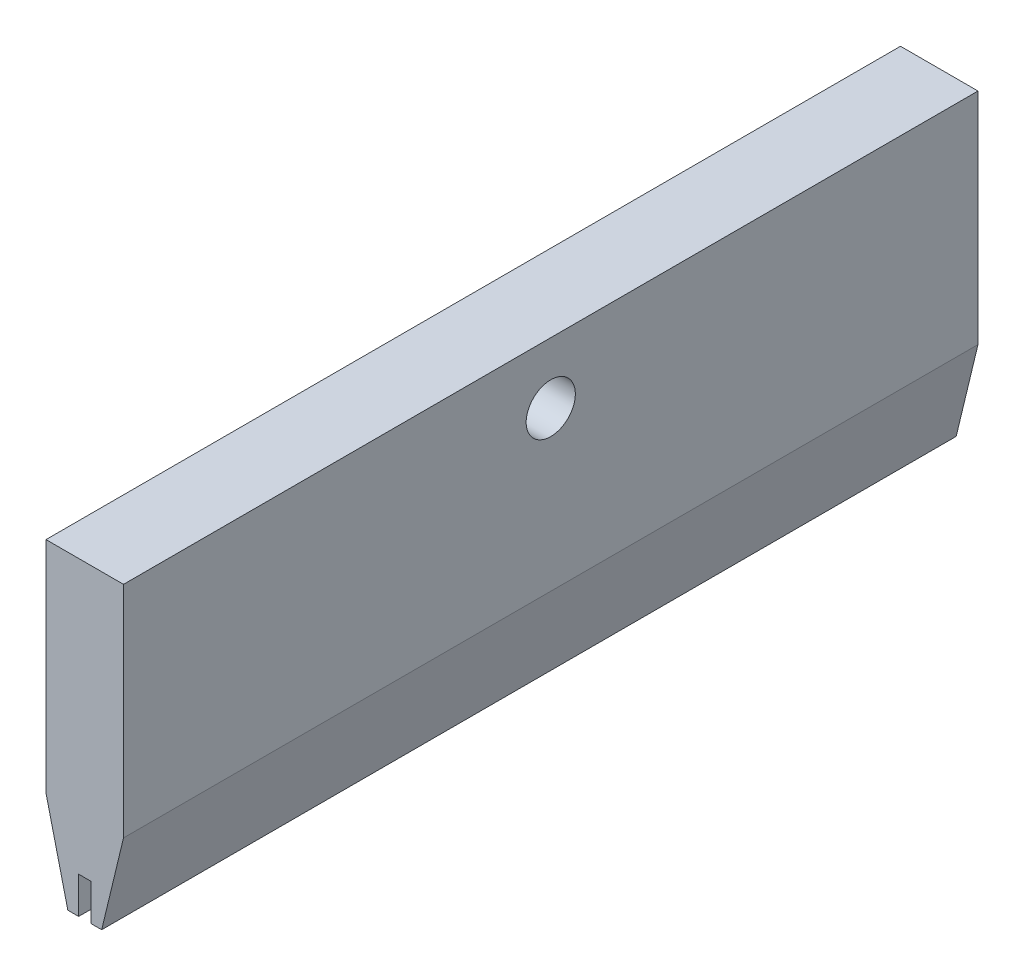
ISO-10303-21;
HEADER;
FILE_DESCRIPTION(('STEP AP214'),'2;1');
FILE_NAME('part.step','',(''),(''),'','','');
FILE_SCHEMA(('AUTOMOTIVE_DESIGN { 1 0 10303 214 1 1 1 1 }'));
ENDSEC;
DATA;
#1=APPLICATION_CONTEXT('core data for automotive mechanical design processes');
#2=APPLICATION_PROTOCOL_DEFINITION('international standard','automotive_design',2000,#1);
#3=PRODUCT_CONTEXT('',#1,'mechanical');
#4=PRODUCT('Part','Part','',(#3));
#5=PRODUCT_RELATED_PRODUCT_CATEGORY('part','',(#4));
#6=PRODUCT_DEFINITION_FORMATION('','',#4);
#7=PRODUCT_DEFINITION_CONTEXT('part definition',#1,'design');
#8=PRODUCT_DEFINITION('design','',#6,#7);
#9=PRODUCT_DEFINITION_SHAPE('','',#8);
#10=(LENGTH_UNIT() NAMED_UNIT(*) SI_UNIT(.MILLI.,.METRE.));
#11=(NAMED_UNIT(*) PLANE_ANGLE_UNIT() SI_UNIT($,.RADIAN.));
#12=(NAMED_UNIT(*) SI_UNIT($,.STERADIAN.) SOLID_ANGLE_UNIT());
#13=UNCERTAINTY_MEASURE_WITH_UNIT(LENGTH_MEASURE(1.E-05),#10,'distance_accuracy_value','');
#14=(GEOMETRIC_REPRESENTATION_CONTEXT(3) GLOBAL_UNCERTAINTY_ASSIGNED_CONTEXT((#13)) GLOBAL_UNIT_ASSIGNED_CONTEXT((#10,
#11,#12)) REPRESENTATION_CONTEXT('',''));
#15=CARTESIAN_POINT('',(0.,0.,0.));
#16=DIRECTION('',(0.,0.,1.));
#17=DIRECTION('',(1.,0.,0.));
#18=AXIS2_PLACEMENT_3D('',#15,#16,#17);
#19=CARTESIAN_POINT('',(0.,-25.4,140.));
#20=DIRECTION('',(0.,-1.,0.));
#21=DIRECTION('',(0.,0.,-1.));
#22=AXIS2_PLACEMENT_3D('',#19,#20,#21);
#23=PLANE('',#22);
#24=DIRECTION('',(-1.,0.,0.));
#25=VECTOR('',#24,1.);
#26=CARTESIAN_POINT('',(0.,-25.4,0.));
#27=LINE('',#26,#25);
#28=CARTESIAN_POINT('',(-1.,-25.4,0.));
#29=VERTEX_POINT('',#28);
#30=CARTESIAN_POINT('',(-2.77322203672788,-25.4,0.));
#31=VERTEX_POINT('',#30);
#32=EDGE_CURVE('E139',#29,#31,#27,.T.);
#33=ORIENTED_EDGE('',*,*,#32,.F.);
#34=DIRECTION('',(0.,0.,-1.));
#35=VECTOR('',#34,1.);
#36=CARTESIAN_POINT('',(-1.,-25.4,140.));
#37=LINE('',#36,#35);
#38=CARTESIAN_POINT('',(-1.,-25.4,140.));
#39=VERTEX_POINT('',#38);
#40=EDGE_CURVE('E11',#39,#29,#37,.T.);
#41=ORIENTED_EDGE('',*,*,#40,.F.);
#42=DIRECTION('',(-1.,0.,0.));
#43=VECTOR('',#42,1.);
#44=CARTESIAN_POINT('',(0.,-25.4,140.));
#45=LINE('',#44,#43);
#46=CARTESIAN_POINT('',(-2.77322203672788,-25.4,140.));
#47=VERTEX_POINT('',#46);
#48=EDGE_CURVE('E162',#39,#47,#45,.T.);
#49=ORIENTED_EDGE('',*,*,#48,.T.);
#50=DIRECTION('',(0.,0.,-1.));
#51=VECTOR('',#50,1.);
#52=CARTESIAN_POINT('',(-2.77322203672788,-25.4,140.));
#53=LINE('',#52,#51);
#54=EDGE_CURVE('E50',#47,#31,#53,.T.);
#55=ORIENTED_EDGE('',*,*,#54,.T.);
#56=EDGE_LOOP('',(#33,#41,#49,#55));
#57=FACE_BOUND('',#56,.T.);
#58=ADVANCED_FACE('F33',(#57),#23,.T.);
#59=CARTESIAN_POINT('',(-1.,0.,140.));
#60=DIRECTION('',(1.,0.,0.));
#61=DIRECTION('',(0.,1.,0.));
#62=AXIS2_PLACEMENT_3D('',#59,#60,#61);
#63=PLANE('',#62);
#64=DIRECTION('',(0.,-1.,0.));
#65=VECTOR('',#64,1.);
#66=CARTESIAN_POINT('',(-1.,0.,0.));
#67=LINE('',#66,#65);
#68=CARTESIAN_POINT('',(-1.,-19.4,0.));
#69=VERTEX_POINT('',#68);
#70=EDGE_CURVE('E141',#69,#29,#67,.T.);
#71=ORIENTED_EDGE('',*,*,#70,.F.);
#72=DIRECTION('',(0.,0.,-1.));
#73=VECTOR('',#72,1.);
#74=CARTESIAN_POINT('',(-1.,-19.4,140.));
#75=LINE('',#74,#73);
#76=CARTESIAN_POINT('',(-1.,-19.4,140.));
#77=VERTEX_POINT('',#76);
#78=EDGE_CURVE('E42',#77,#69,#75,.T.);
#79=ORIENTED_EDGE('',*,*,#78,.F.);
#80=DIRECTION('',(0.,-1.,0.));
#81=VECTOR('',#80,1.);
#82=CARTESIAN_POINT('',(-1.,0.,140.));
#83=LINE('',#82,#81);
#84=EDGE_CURVE('E190',#77,#39,#83,.T.);
#85=ORIENTED_EDGE('',*,*,#84,.T.);
#86=ORIENTED_EDGE('',*,*,#40,.T.);
#87=EDGE_LOOP('',(#71,#79,#85,#86));
#88=FACE_BOUND('',#87,.T.);
#89=ADVANCED_FACE('F189',(#88),#63,.T.);
#90=CARTESIAN_POINT('',(-1.346145417358E-13,-19.4,140.));
#91=DIRECTION('',(0.,1.,0.));
#92=DIRECTION('',(-1.,0.,0.));
#93=AXIS2_PLACEMENT_3D('',#90,#91,#92);
#94=PLANE('',#93);
#95=DIRECTION('',(1.,0.,0.));
#96=VECTOR('',#95,1.);
#97=CARTESIAN_POINT('',(-1.346145417358E-13,-19.4,0.));
#98=LINE('',#97,#96);
#99=CARTESIAN_POINT('',(1.,-19.4,0.));
#100=VERTEX_POINT('',#99);
#101=EDGE_CURVE('E144',#69,#100,#98,.T.);
#102=ORIENTED_EDGE('',*,*,#101,.T.);
#103=DIRECTION('',(0.,0.,-1.));
#104=VECTOR('',#103,1.);
#105=CARTESIAN_POINT('',(1.,-19.4,140.));
#106=LINE('',#105,#104);
#107=CARTESIAN_POINT('',(1.,-19.4,140.));
#108=VERTEX_POINT('',#107);
#109=EDGE_CURVE('E173',#108,#100,#106,.T.);
#110=ORIENTED_EDGE('',*,*,#109,.F.);
#111=DIRECTION('',(1.,0.,0.));
#112=VECTOR('',#111,1.);
#113=CARTESIAN_POINT('',(-1.346145417358E-13,-19.4,140.));
#114=LINE('',#113,#112);
#115=EDGE_CURVE('E181',#77,#108,#114,.T.);
#116=ORIENTED_EDGE('',*,*,#115,.F.);
#117=ORIENTED_EDGE('',*,*,#78,.T.);
#118=EDGE_LOOP('',(#102,#110,#116,#117));
#119=FACE_BOUND('',#118,.T.);
#120=ADVANCED_FACE('F179',(#119),#94,.F.);
#121=CARTESIAN_POINT('',(1.00000000000001,0.,140.));
#122=DIRECTION('',(1.,0.,0.));
#123=DIRECTION('',(0.,1.,0.));
#124=AXIS2_PLACEMENT_3D('',#121,#122,#123);
#125=PLANE('',#124);
#126=DIRECTION('',(0.,-1.,0.));
#127=VECTOR('',#126,1.);
#128=CARTESIAN_POINT('',(1.00000000000001,0.,0.));
#129=LINE('',#128,#127);
#130=CARTESIAN_POINT('',(1.,-25.4,0.));
#131=VERTEX_POINT('',#130);
#132=EDGE_CURVE('E146',#100,#131,#129,.T.);
#133=ORIENTED_EDGE('',*,*,#132,.T.);
#134=DIRECTION('',(0.,0.,-1.));
#135=VECTOR('',#134,1.);
#136=CARTESIAN_POINT('',(1.,-25.4,140.));
#137=LINE('',#136,#135);
#138=CARTESIAN_POINT('',(1.,-25.4,140.));
#139=VERTEX_POINT('',#138);
#140=EDGE_CURVE('E171',#139,#131,#137,.T.);
#141=ORIENTED_EDGE('',*,*,#140,.F.);
#142=DIRECTION('',(0.,-1.,0.));
#143=VECTOR('',#142,1.);
#144=CARTESIAN_POINT('',(1.00000000000001,0.,140.));
#145=LINE('',#144,#143);
#146=EDGE_CURVE('E281',#108,#139,#145,.T.);
#147=ORIENTED_EDGE('',*,*,#146,.F.);
#148=ORIENTED_EDGE('',*,*,#109,.T.);
#149=EDGE_LOOP('',(#133,#141,#147,#148));
#150=FACE_BOUND('',#149,.T.);
#151=ADVANCED_FACE('F209',(#150),#125,.F.);
#152=CARTESIAN_POINT('',(0.,-25.4,140.));
#153=DIRECTION('',(0.,-1.,0.));
#154=DIRECTION('',(0.,0.,-1.));
#155=AXIS2_PLACEMENT_3D('',#152,#153,#154);
#156=PLANE('',#155);
#157=DIRECTION('',(-1.,0.,0.));
#158=VECTOR('',#157,1.);
#159=CARTESIAN_POINT('',(0.,-25.4,0.));
#160=LINE('',#159,#158);
#161=CARTESIAN_POINT('',(2.77322203672788,-25.4,0.));
#162=VERTEX_POINT('',#161);
#163=EDGE_CURVE('E149',#162,#131,#160,.T.);
#164=ORIENTED_EDGE('',*,*,#163,.F.);
#165=DIRECTION('',(0.,0.,-1.));
#166=VECTOR('',#165,1.);
#167=CARTESIAN_POINT('',(2.77322203672788,-25.4,140.));
#168=LINE('',#167,#166);
#169=CARTESIAN_POINT('',(2.77322203672788,-25.4,140.));
#170=VERTEX_POINT('',#169);
#171=EDGE_CURVE('E169',#170,#162,#168,.T.);
#172=ORIENTED_EDGE('',*,*,#171,.F.);
#173=DIRECTION('',(-1.,0.,0.));
#174=VECTOR('',#173,1.);
#175=CARTESIAN_POINT('',(0.,-25.4,140.));
#176=LINE('',#175,#174);
#177=EDGE_CURVE('E283',#170,#139,#176,.T.);
#178=ORIENTED_EDGE('',*,*,#177,.T.);
#179=ORIENTED_EDGE('',*,*,#140,.T.);
#180=EDGE_LOOP('',(#164,#172,#178,#179));
#181=FACE_BOUND('',#180,.T.);
#182=ADVANCED_FACE('F214',(#181),#156,.T.);
#183=CARTESIAN_POINT('',(8.41220755688692,-2.02977585080134,140.));
#184=DIRECTION('',(-0.972102158062594,0.234557869810516,0.));
#185=DIRECTION('',(-0.234557869810516,-0.972102158062594,0.));
#186=AXIS2_PLACEMENT_3D('',#183,#184,#185);
#187=PLANE('',#186);
#188=DIRECTION('',(0.234557869810516,0.972102158062594,0.));
#189=VECTOR('',#188,1.);
#190=CARTESIAN_POINT('',(8.41220755688692,-2.02977585080134,0.));
#191=LINE('',#190,#189);
#192=CARTESIAN_POINT('',(6.35,-10.5763934426229,0.));
#193=VERTEX_POINT('',#192);
#194=EDGE_CURVE('E152',#162,#193,#191,.T.);
#195=ORIENTED_EDGE('',*,*,#194,.T.);
#196=DIRECTION('',(0.,0.,-1.));
#197=VECTOR('',#196,1.);
#198=CARTESIAN_POINT('',(6.35,-10.5763934426229,140.));
#199=LINE('',#198,#197);
#200=CARTESIAN_POINT('',(6.35,-10.5763934426229,140.));
#201=VERTEX_POINT('',#200);
#202=EDGE_CURVE('E166',#201,#193,#199,.T.);
#203=ORIENTED_EDGE('',*,*,#202,.F.);
#204=DIRECTION('',(0.234557869810516,0.972102158062594,0.));
#205=VECTOR('',#204,1.);
#206=CARTESIAN_POINT('',(8.41220755688692,-2.02977585080134,140.));
#207=LINE('',#206,#205);
#208=EDGE_CURVE('E286',#170,#201,#207,.T.);
#209=ORIENTED_EDGE('',*,*,#208,.F.);
#210=ORIENTED_EDGE('',*,*,#171,.T.);
#211=EDGE_LOOP('',(#195,#203,#209,#210));
#212=FACE_BOUND('',#211,.T.);
#213=ADVANCED_FACE('F218',(#212),#187,.F.);
#214=CARTESIAN_POINT('',(6.35,0.,140.));
#215=DIRECTION('',(-1.,0.,0.));
#216=DIRECTION('',(0.,0.,1.));
#217=AXIS2_PLACEMENT_3D('',#214,#215,#216);
#218=PLANE('',#217);
#219=CARTESIAN_POINT('',(6.35,15.4,70.));
#220=DIRECTION('',(1.,0.,0.));
#221=DIRECTION('',(0.,0.,-1.));
#222=AXIS2_PLACEMENT_3D('',#219,#220,#221);
#223=CIRCLE('',#222,4.02964020349436);
#224=CARTESIAN_POINT('',(6.35,15.4,65.9703597965056));
#225=VERTEX_POINT('',#224);
#226=EDGE_CURVE('E275',#225,#225,#223,.T.);
#227=ORIENTED_EDGE('',*,*,#226,.F.);
#228=EDGE_LOOP('',(#227));
#229=FACE_BOUND('',#228,.T.);
#230=DIRECTION('',(0.,1.,0.));
#231=VECTOR('',#230,1.);
#232=CARTESIAN_POINT('',(6.35,0.,0.));
#233=LINE('',#232,#231);
#234=CARTESIAN_POINT('',(6.35,25.4,0.));
#235=VERTEX_POINT('',#234);
#236=EDGE_CURVE('E154',#193,#235,#233,.T.);
#237=ORIENTED_EDGE('',*,*,#236,.T.);
#238=DIRECTION('',(0.,0.,-1.));
#239=VECTOR('',#238,1.);
#240=CARTESIAN_POINT('',(6.35,25.4,140.));
#241=LINE('',#240,#239);
#242=CARTESIAN_POINT('',(6.35,25.4,140.));
#243=VERTEX_POINT('',#242);
#244=EDGE_CURVE('E131',#243,#235,#241,.T.);
#245=ORIENTED_EDGE('',*,*,#244,.F.);
#246=DIRECTION('',(0.,1.,0.));
#247=VECTOR('',#246,1.);
#248=CARTESIAN_POINT('',(6.35,0.,140.));
#249=LINE('',#248,#247);
#250=EDGE_CURVE('E119',#201,#243,#249,.T.);
#251=ORIENTED_EDGE('',*,*,#250,.F.);
#252=ORIENTED_EDGE('',*,*,#202,.T.);
#253=EDGE_LOOP('',(#237,#245,#251,#252));
#254=FACE_BOUND('',#253,.T.);
#255=ADVANCED_FACE('F222',(#229,#254),#218,.F.);
#256=CARTESIAN_POINT('',(0.,25.4,140.));
#257=DIRECTION('',(0.,-1.,0.));
#258=DIRECTION('',(0.,0.,-1.));
#259=AXIS2_PLACEMENT_3D('',#256,#257,#258);
#260=PLANE('',#259);
#261=DIRECTION('',(-1.,0.,0.));
#262=VECTOR('',#261,1.);
#263=CARTESIAN_POINT('',(0.,25.4,0.));
#264=LINE('',#263,#262);
#265=CARTESIAN_POINT('',(-6.35,25.4,0.));
#266=VERTEX_POINT('',#265);
#267=EDGE_CURVE('E128',#235,#266,#264,.T.);
#268=ORIENTED_EDGE('',*,*,#267,.T.);
#269=DIRECTION('',(0.,0.,-1.));
#270=VECTOR('',#269,1.);
#271=CARTESIAN_POINT('',(-6.35,25.4,140.));
#272=LINE('',#271,#270);
#273=CARTESIAN_POINT('',(-6.35,25.4,140.));
#274=VERTEX_POINT('',#273);
#275=EDGE_CURVE('E125',#274,#266,#272,.T.);
#276=ORIENTED_EDGE('',*,*,#275,.F.);
#277=DIRECTION('',(-1.,0.,0.));
#278=VECTOR('',#277,1.);
#279=CARTESIAN_POINT('',(0.,25.4,140.));
#280=LINE('',#279,#278);
#281=EDGE_CURVE('E112',#243,#274,#280,.T.);
#282=ORIENTED_EDGE('',*,*,#281,.F.);
#283=ORIENTED_EDGE('',*,*,#244,.T.);
#284=EDGE_LOOP('',(#268,#276,#282,#283));
#285=FACE_BOUND('',#284,.T.);
#286=ADVANCED_FACE('F126',(#285),#260,.F.);
#287=CARTESIAN_POINT('',(-6.35,0.,140.));
#288=DIRECTION('',(-1.,0.,0.));
#289=DIRECTION('',(0.,0.,1.));
#290=AXIS2_PLACEMENT_3D('',#287,#288,#289);
#291=PLANE('',#290);
#292=CARTESIAN_POINT('',(-6.34999999999999,15.4,70.));
#293=DIRECTION('',(-1.,0.,0.));
#294=DIRECTION('',(0.,0.,1.));
#295=AXIS2_PLACEMENT_3D('',#292,#293,#294);
#296=CIRCLE('',#295,4.02964020349436);
#297=CARTESIAN_POINT('',(-6.34999999999999,15.4,74.0296402034944));
#298=VERTEX_POINT('',#297);
#299=EDGE_CURVE('E36',#298,#298,#296,.T.);
#300=ORIENTED_EDGE('',*,*,#299,.F.);
#301=EDGE_LOOP('',(#300));
#302=FACE_BOUND('',#301,.T.);
#303=DIRECTION('',(0.,1.,0.));
#304=VECTOR('',#303,1.);
#305=CARTESIAN_POINT('',(-6.35,0.,0.));
#306=LINE('',#305,#304);
#307=CARTESIAN_POINT('',(-6.35,-10.5763934426229,0.));
#308=VERTEX_POINT('',#307);
#309=EDGE_CURVE('E157',#308,#266,#306,.T.);
#310=ORIENTED_EDGE('',*,*,#309,.F.);
#311=DIRECTION('',(0.,0.,-1.));
#312=VECTOR('',#311,1.);
#313=CARTESIAN_POINT('',(-6.35,-10.5763934426229,140.));
#314=LINE('',#313,#312);
#315=CARTESIAN_POINT('',(-6.35,-10.5763934426229,140.));
#316=VERTEX_POINT('',#315);
#317=EDGE_CURVE('E81',#316,#308,#314,.T.);
#318=ORIENTED_EDGE('',*,*,#317,.F.);
#319=DIRECTION('',(0.,1.,0.));
#320=VECTOR('',#319,1.);
#321=CARTESIAN_POINT('',(-6.35,0.,140.));
#322=LINE('',#321,#320);
#323=EDGE_CURVE('E117',#316,#274,#322,.T.);
#324=ORIENTED_EDGE('',*,*,#323,.T.);
#325=ORIENTED_EDGE('',*,*,#275,.T.);
#326=EDGE_LOOP('',(#310,#318,#324,#325));
#327=FACE_BOUND('',#326,.T.);
#328=ADVANCED_FACE('F133',(#302,#327),#291,.T.);
#329=CARTESIAN_POINT('',(-8.41220755688691,-2.02977585080134,140.));
#330=DIRECTION('',(-0.972102158062594,-0.234557869810516,0.));
#331=DIRECTION('',(0.234557869810516,-0.972102158062594,0.));
#332=AXIS2_PLACEMENT_3D('',#329,#330,#331);
#333=PLANE('',#332);
#334=DIRECTION('',(-0.234557869810516,0.972102158062594,0.));
#335=VECTOR('',#334,1.);
#336=CARTESIAN_POINT('',(-8.41220755688691,-2.02977585080134,0.));
#337=LINE('',#336,#335);
#338=EDGE_CURVE('E159',#31,#308,#337,.T.);
#339=ORIENTED_EDGE('',*,*,#338,.F.);
#340=ORIENTED_EDGE('',*,*,#54,.F.);
#341=DIRECTION('',(-0.234557869810516,0.972102158062594,0.));
#342=VECTOR('',#341,1.);
#343=CARTESIAN_POINT('',(-8.41220755688691,-2.02977585080134,140.));
#344=LINE('',#343,#342);
#345=EDGE_CURVE('E134',#47,#316,#344,.T.);
#346=ORIENTED_EDGE('',*,*,#345,.T.);
#347=ORIENTED_EDGE('',*,*,#317,.T.);
#348=EDGE_LOOP('',(#339,#340,#346,#347));
#349=FACE_BOUND('',#348,.T.);
#350=ADVANCED_FACE('F191',(#349),#333,.T.);
#351=CARTESIAN_POINT('',(0.,0.,140.));
#352=DIRECTION('',(0.,0.,1.));
#353=DIRECTION('',(1.,0.,0.));
#354=AXIS2_PLACEMENT_3D('',#351,#352,#353);
#355=PLANE('',#354);
#356=ORIENTED_EDGE('',*,*,#48,.F.);
#357=ORIENTED_EDGE('',*,*,#84,.F.);
#358=ORIENTED_EDGE('',*,*,#115,.T.);
#359=ORIENTED_EDGE('',*,*,#146,.T.);
#360=ORIENTED_EDGE('',*,*,#177,.F.);
#361=ORIENTED_EDGE('',*,*,#208,.T.);
#362=ORIENTED_EDGE('',*,*,#250,.T.);
#363=ORIENTED_EDGE('',*,*,#281,.T.);
#364=ORIENTED_EDGE('',*,*,#323,.F.);
#365=ORIENTED_EDGE('',*,*,#345,.F.);
#366=EDGE_LOOP('',(#356,#357,#358,#359,#360,#361,#362,#363,#364,#365));
#367=FACE_BOUND('',#366,.T.);
#368=ADVANCED_FACE('F114',(#367),#355,.T.);
#369=CARTESIAN_POINT('',(0.,0.,0.));
#370=DIRECTION('',(0.,0.,1.));
#371=DIRECTION('',(1.,0.,0.));
#372=AXIS2_PLACEMENT_3D('',#369,#370,#371);
#373=PLANE('',#372);
#374=ORIENTED_EDGE('',*,*,#32,.T.);
#375=ORIENTED_EDGE('',*,*,#338,.T.);
#376=ORIENTED_EDGE('',*,*,#309,.T.);
#377=ORIENTED_EDGE('',*,*,#267,.F.);
#378=ORIENTED_EDGE('',*,*,#236,.F.);
#379=ORIENTED_EDGE('',*,*,#194,.F.);
#380=ORIENTED_EDGE('',*,*,#163,.T.);
#381=ORIENTED_EDGE('',*,*,#132,.F.);
#382=ORIENTED_EDGE('',*,*,#101,.F.);
#383=ORIENTED_EDGE('',*,*,#70,.T.);
#384=EDGE_LOOP('',(#374,#375,#376,#377,#378,#379,#380,#381,#382,#383));
#385=FACE_BOUND('',#384,.T.);
#386=ADVANCED_FACE('F188',(#385),#373,.F.);
#387=CARTESIAN_POINT('',(-133.65,15.4,70.));
#388=DIRECTION('',(1.,0.,0.));
#389=DIRECTION('',(0.,0.,-1.));
#390=AXIS2_PLACEMENT_3D('',#387,#388,#389);
#391=CYLINDRICAL_SURFACE('',#390,4.02964020349436);
#392=ORIENTED_EDGE('',*,*,#299,.T.);
#393=EDGE_LOOP('',(#392));
#394=FACE_BOUND('',#393,.T.);
#395=ORIENTED_EDGE('',*,*,#226,.T.);
#396=EDGE_LOOP('',(#395));
#397=FACE_BOUND('',#396,.T.);
#398=ADVANCED_FACE('F246',(#394,#397),#391,.F.);
#399=CLOSED_SHELL('',(#58,#89,#120,#151,#182,#213,#255,#286,#328,#350,#368,#386,#398));
#400=MANIFOLD_SOLID_BREP('B2',#399);
#401=ADVANCED_BREP_SHAPE_REPRESENTATION('',(#18,#400),#14);
#402=SHAPE_DEFINITION_REPRESENTATION(#9,#401);
ENDSEC;
END-ISO-10303-21;
